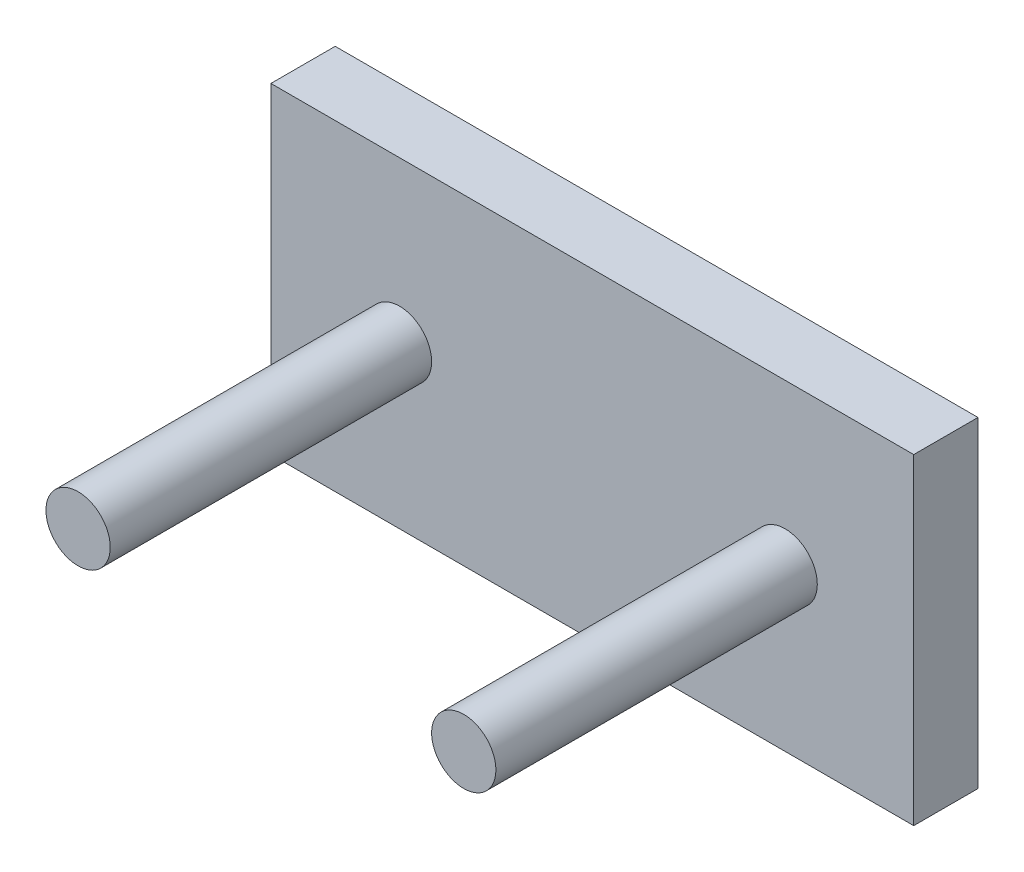
ISO-10303-21;
HEADER;
FILE_DESCRIPTION(('STEP AP214'),'2;1');
FILE_NAME('part.step','',(''),(''),'','','');
FILE_SCHEMA(('AUTOMOTIVE_DESIGN { 1 0 10303 214 1 1 1 1 }'));
ENDSEC;
DATA;
#1=APPLICATION_CONTEXT('core data for automotive mechanical design processes');
#2=APPLICATION_PROTOCOL_DEFINITION('international standard','automotive_design',2000,#1);
#3=PRODUCT_CONTEXT('',#1,'mechanical');
#4=PRODUCT('Part','Part','',(#3));
#5=PRODUCT_RELATED_PRODUCT_CATEGORY('part','',(#4));
#6=PRODUCT_DEFINITION_FORMATION('','',#4);
#7=PRODUCT_DEFINITION_CONTEXT('part definition',#1,'design');
#8=PRODUCT_DEFINITION('design','',#6,#7);
#9=PRODUCT_DEFINITION_SHAPE('','',#8);
#10=(LENGTH_UNIT() NAMED_UNIT(*) SI_UNIT(.MILLI.,.METRE.));
#11=(NAMED_UNIT(*) PLANE_ANGLE_UNIT() SI_UNIT($,.RADIAN.));
#12=(NAMED_UNIT(*) SI_UNIT($,.STERADIAN.) SOLID_ANGLE_UNIT());
#13=UNCERTAINTY_MEASURE_WITH_UNIT(LENGTH_MEASURE(1.E-05),#10,'distance_accuracy_value','');
#14=(GEOMETRIC_REPRESENTATION_CONTEXT(3) GLOBAL_UNCERTAINTY_ASSIGNED_CONTEXT((#13)) GLOBAL_UNIT_ASSIGNED_CONTEXT((#10,
#11,#12)) REPRESENTATION_CONTEXT('',''));
#15=CARTESIAN_POINT('',(0.,0.,0.));
#16=DIRECTION('',(0.,0.,1.));
#17=DIRECTION('',(1.,0.,0.));
#18=AXIS2_PLACEMENT_3D('',#15,#16,#17);
#19=CARTESIAN_POINT('',(0.,25.,10.));
#20=DIRECTION('',(0.,-1.,0.));
#21=DIRECTION('',(1.,0.,0.));
#22=AXIS2_PLACEMENT_3D('',#19,#20,#21);
#23=PLANE('',#22);
#24=DIRECTION('',(-1.,0.,0.));
#25=VECTOR('',#24,1.);
#26=CARTESIAN_POINT('',(0.,25.,0.));
#27=LINE('',#26,#25);
#28=CARTESIAN_POINT('',(50.,25.,0.));
#29=VERTEX_POINT('',#28);
#30=CARTESIAN_POINT('',(-50.,25.,0.));
#31=VERTEX_POINT('',#30);
#32=EDGE_CURVE('E98',#29,#31,#27,.T.);
#33=ORIENTED_EDGE('',*,*,#32,.T.);
#34=DIRECTION('',(0.,0.,-1.));
#35=VECTOR('',#34,1.);
#36=CARTESIAN_POINT('',(-50.,25.,10.));
#37=LINE('',#36,#35);
#38=CARTESIAN_POINT('',(-50.,25.,10.));
#39=VERTEX_POINT('',#38);
#40=EDGE_CURVE('E11',#39,#31,#37,.T.);
#41=ORIENTED_EDGE('',*,*,#40,.F.);
#42=DIRECTION('',(-1.,0.,0.));
#43=VECTOR('',#42,1.);
#44=CARTESIAN_POINT('',(0.,25.,10.));
#45=LINE('',#44,#43);
#46=CARTESIAN_POINT('',(50.,25.,10.));
#47=VERTEX_POINT('',#46);
#48=EDGE_CURVE('E84',#47,#39,#45,.T.);
#49=ORIENTED_EDGE('',*,*,#48,.F.);
#50=DIRECTION('',(0.,0.,-1.));
#51=VECTOR('',#50,1.);
#52=CARTESIAN_POINT('',(50.,25.,10.));
#53=LINE('',#52,#51);
#54=EDGE_CURVE('E51',#47,#29,#53,.T.);
#55=ORIENTED_EDGE('',*,*,#54,.T.);
#56=EDGE_LOOP('',(#33,#41,#49,#55));
#57=FACE_BOUND('',#56,.T.);
#58=ADVANCED_FACE('F35',(#57),#23,.F.);
#59=CARTESIAN_POINT('',(-50.,0.,10.));
#60=DIRECTION('',(1.,0.,0.));
#61=DIRECTION('',(0.,1.,0.));
#62=AXIS2_PLACEMENT_3D('',#59,#60,#61);
#63=PLANE('',#62);
#64=DIRECTION('',(0.,-1.,0.));
#65=VECTOR('',#64,1.);
#66=CARTESIAN_POINT('',(-50.,0.,0.));
#67=LINE('',#66,#65);
#68=CARTESIAN_POINT('',(-50.,-25.,0.));
#69=VERTEX_POINT('',#68);
#70=EDGE_CURVE('E89',#31,#69,#67,.T.);
#71=ORIENTED_EDGE('',*,*,#70,.T.);
#72=DIRECTION('',(0.,0.,-1.));
#73=VECTOR('',#72,1.);
#74=CARTESIAN_POINT('',(-50.,-25.,10.));
#75=LINE('',#74,#73);
#76=CARTESIAN_POINT('',(-50.,-25.,10.));
#77=VERTEX_POINT('',#76);
#78=EDGE_CURVE('E43',#77,#69,#75,.T.);
#79=ORIENTED_EDGE('',*,*,#78,.F.);
#80=DIRECTION('',(0.,-1.,0.));
#81=VECTOR('',#80,1.);
#82=CARTESIAN_POINT('',(-50.,0.,10.));
#83=LINE('',#82,#81);
#84=EDGE_CURVE('E76',#39,#77,#83,.T.);
#85=ORIENTED_EDGE('',*,*,#84,.F.);
#86=ORIENTED_EDGE('',*,*,#40,.T.);
#87=EDGE_LOOP('',(#71,#79,#85,#86));
#88=FACE_BOUND('',#87,.T.);
#89=ADVANCED_FACE('F88',(#88),#63,.F.);
#90=CARTESIAN_POINT('',(0.,-25.,10.));
#91=DIRECTION('',(0.,-1.,0.));
#92=DIRECTION('',(1.,0.,0.));
#93=AXIS2_PLACEMENT_3D('',#90,#91,#92);
#94=PLANE('',#93);
#95=DIRECTION('',(-1.,0.,0.));
#96=VECTOR('',#95,1.);
#97=CARTESIAN_POINT('',(0.,-25.,0.));
#98=LINE('',#97,#96);
#99=CARTESIAN_POINT('',(50.,-25.,0.));
#100=VERTEX_POINT('',#99);
#101=EDGE_CURVE('E102',#100,#69,#98,.T.);
#102=ORIENTED_EDGE('',*,*,#101,.F.);
#103=DIRECTION('',(0.,0.,-1.));
#104=VECTOR('',#103,1.);
#105=CARTESIAN_POINT('',(50.,-25.,10.));
#106=LINE('',#105,#104);
#107=CARTESIAN_POINT('',(50.,-25.,10.));
#108=VERTEX_POINT('',#107);
#109=EDGE_CURVE('E65',#108,#100,#106,.T.);
#110=ORIENTED_EDGE('',*,*,#109,.F.);
#111=DIRECTION('',(-1.,0.,0.));
#112=VECTOR('',#111,1.);
#113=CARTESIAN_POINT('',(0.,-25.,10.));
#114=LINE('',#113,#112);
#115=EDGE_CURVE('E83',#108,#77,#114,.T.);
#116=ORIENTED_EDGE('',*,*,#115,.T.);
#117=ORIENTED_EDGE('',*,*,#78,.T.);
#118=EDGE_LOOP('',(#102,#110,#116,#117));
#119=FACE_BOUND('',#118,.T.);
#120=ADVANCED_FACE('F92',(#119),#94,.T.);
#121=CARTESIAN_POINT('',(50.,0.,10.));
#122=DIRECTION('',(1.,0.,0.));
#123=DIRECTION('',(0.,0.,-1.));
#124=AXIS2_PLACEMENT_3D('',#121,#122,#123);
#125=PLANE('',#124);
#126=DIRECTION('',(0.,-1.,0.));
#127=VECTOR('',#126,1.);
#128=CARTESIAN_POINT('',(50.,0.,0.));
#129=LINE('',#128,#127);
#130=EDGE_CURVE('E104',#29,#100,#129,.T.);
#131=ORIENTED_EDGE('',*,*,#130,.F.);
#132=ORIENTED_EDGE('',*,*,#54,.F.);
#133=DIRECTION('',(0.,-1.,0.));
#134=VECTOR('',#133,1.);
#135=CARTESIAN_POINT('',(50.,0.,10.));
#136=LINE('',#135,#134);
#137=EDGE_CURVE('E93',#47,#108,#136,.T.);
#138=ORIENTED_EDGE('',*,*,#137,.T.);
#139=ORIENTED_EDGE('',*,*,#109,.T.);
#140=EDGE_LOOP('',(#131,#132,#138,#139));
#141=FACE_BOUND('',#140,.T.);
#142=ADVANCED_FACE('F143',(#141),#125,.T.);
#143=CARTESIAN_POINT('',(0.,0.,10.));
#144=DIRECTION('',(0.,0.,1.));
#145=DIRECTION('',(1.,0.,0.));
#146=AXIS2_PLACEMENT_3D('',#143,#144,#145);
#147=PLANE('',#146);
#148=CARTESIAN_POINT('',(30.,0.,10.));
#149=DIRECTION('',(0.,0.,1.));
#150=DIRECTION('',(1.,0.,0.));
#151=AXIS2_PLACEMENT_3D('',#148,#149,#150);
#152=CIRCLE('',#151,5.);
#153=CARTESIAN_POINT('',(35.,0.,10.));
#154=VERTEX_POINT('',#153);
#155=EDGE_CURVE('E115',#154,#154,#152,.F.);
#156=ORIENTED_EDGE('',*,*,#155,.T.);
#157=EDGE_LOOP('',(#156));
#158=FACE_BOUND('',#157,.T.);
#159=CARTESIAN_POINT('',(-30.,0.,10.));
#160=DIRECTION('',(0.,0.,1.));
#161=DIRECTION('',(1.,0.,0.));
#162=AXIS2_PLACEMENT_3D('',#159,#160,#161);
#163=CIRCLE('',#162,5.);
#164=CARTESIAN_POINT('',(-25.,0.,10.));
#165=VERTEX_POINT('',#164);
#166=EDGE_CURVE('E100',#165,#165,#163,.F.);
#167=ORIENTED_EDGE('',*,*,#166,.T.);
#168=EDGE_LOOP('',(#167));
#169=FACE_BOUND('',#168,.T.);
#170=ORIENTED_EDGE('',*,*,#48,.T.);
#171=ORIENTED_EDGE('',*,*,#84,.T.);
#172=ORIENTED_EDGE('',*,*,#115,.F.);
#173=ORIENTED_EDGE('',*,*,#137,.F.);
#174=EDGE_LOOP('',(#170,#171,#172,#173));
#175=FACE_BOUND('',#174,.T.);
#176=ADVANCED_FACE('F80',(#158,#169,#175),#147,.T.);
#177=CARTESIAN_POINT('',(0.,0.,0.));
#178=DIRECTION('',(0.,0.,1.));
#179=DIRECTION('',(1.,0.,0.));
#180=AXIS2_PLACEMENT_3D('',#177,#178,#179);
#181=PLANE('',#180);
#182=ORIENTED_EDGE('',*,*,#32,.F.);
#183=ORIENTED_EDGE('',*,*,#130,.T.);
#184=ORIENTED_EDGE('',*,*,#101,.T.);
#185=ORIENTED_EDGE('',*,*,#70,.F.);
#186=EDGE_LOOP('',(#182,#183,#184,#185));
#187=FACE_BOUND('',#186,.T.);
#188=ADVANCED_FACE('F142',(#187),#181,.F.);
#189=CARTESIAN_POINT('',(-30.,0.,60.));
#190=DIRECTION('',(0.,0.,-1.));
#191=DIRECTION('',(-1.,0.,0.));
#192=AXIS2_PLACEMENT_3D('',#189,#190,#191);
#193=CYLINDRICAL_SURFACE('',#192,5.);
#194=ORIENTED_EDGE('',*,*,#166,.F.);
#195=EDGE_LOOP('',(#194));
#196=FACE_BOUND('',#195,.T.);
#197=CARTESIAN_POINT('',(-30.,0.,60.));
#198=DIRECTION('',(0.,0.,1.));
#199=DIRECTION('',(1.,0.,0.));
#200=AXIS2_PLACEMENT_3D('',#197,#198,#199);
#201=CIRCLE('',#200,5.);
#202=CARTESIAN_POINT('',(-25.,0.,60.));
#203=VERTEX_POINT('',#202);
#204=EDGE_CURVE('E112',#203,#203,#201,.T.);
#205=ORIENTED_EDGE('',*,*,#204,.F.);
#206=EDGE_LOOP('',(#205));
#207=FACE_BOUND('',#206,.T.);
#208=ADVANCED_FACE('F134',(#196,#207),#193,.T.);
#209=CARTESIAN_POINT('',(-30.,0.,60.));
#210=DIRECTION('',(0.,0.,1.));
#211=DIRECTION('',(1.,0.,0.));
#212=AXIS2_PLACEMENT_3D('',#209,#210,#211);
#213=PLANE('',#212);
#214=ORIENTED_EDGE('',*,*,#204,.T.);
#215=EDGE_LOOP('',(#214));
#216=FACE_BOUND('',#215,.T.);
#217=ADVANCED_FACE('F126',(#216),#213,.T.);
#218=CARTESIAN_POINT('',(30.,0.,60.));
#219=DIRECTION('',(0.,0.,-1.));
#220=DIRECTION('',(-1.,0.,0.));
#221=AXIS2_PLACEMENT_3D('',#218,#219,#220);
#222=CYLINDRICAL_SURFACE('',#221,5.);
#223=ORIENTED_EDGE('',*,*,#155,.F.);
#224=EDGE_LOOP('',(#223));
#225=FACE_BOUND('',#224,.T.);
#226=CARTESIAN_POINT('',(30.,0.,60.));
#227=DIRECTION('',(0.,0.,1.));
#228=DIRECTION('',(1.,0.,0.));
#229=AXIS2_PLACEMENT_3D('',#226,#227,#228);
#230=CIRCLE('',#229,5.);
#231=CARTESIAN_POINT('',(35.,0.,60.));
#232=VERTEX_POINT('',#231);
#233=EDGE_CURVE('E118',#232,#232,#230,.T.);
#234=ORIENTED_EDGE('',*,*,#233,.F.);
#235=EDGE_LOOP('',(#234));
#236=FACE_BOUND('',#235,.T.);
#237=ADVANCED_FACE('F124',(#225,#236),#222,.T.);
#238=CARTESIAN_POINT('',(30.,0.,60.));
#239=DIRECTION('',(0.,0.,1.));
#240=DIRECTION('',(1.,0.,0.));
#241=AXIS2_PLACEMENT_3D('',#238,#239,#240);
#242=PLANE('',#241);
#243=ORIENTED_EDGE('',*,*,#233,.T.);
#244=EDGE_LOOP('',(#243));
#245=FACE_BOUND('',#244,.T.);
#246=ADVANCED_FACE('F122',(#245),#242,.T.);
#247=CLOSED_SHELL('',(#58,#89,#120,#142,#176,#188,#208,#217,#237,#246));
#248=MANIFOLD_SOLID_BREP('B2',#247);
#249=ADVANCED_BREP_SHAPE_REPRESENTATION('',(#18,#248),#14);
#250=SHAPE_DEFINITION_REPRESENTATION(#9,#249);
ENDSEC;
END-ISO-10303-21;
